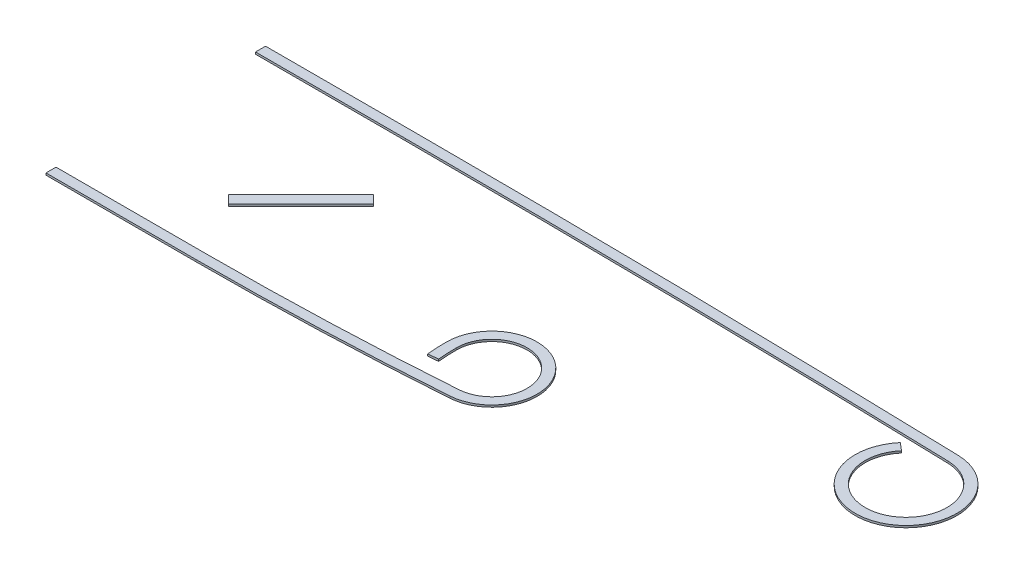
ISO-10303-21;
HEADER;
FILE_DESCRIPTION(('STEP AP214'),'2;1');
FILE_NAME('part.step','',(''),(''),'','','');
FILE_SCHEMA(('AUTOMOTIVE_DESIGN { 1 0 10303 214 1 1 1 1 }'));
ENDSEC;
DATA;
#1=APPLICATION_CONTEXT('core data for automotive mechanical design processes');
#2=APPLICATION_PROTOCOL_DEFINITION('international standard','automotive_design',2000,#1);
#3=PRODUCT_CONTEXT('',#1,'mechanical');
#4=PRODUCT('Part','Part','',(#3));
#5=PRODUCT_RELATED_PRODUCT_CATEGORY('part','',(#4));
#6=PRODUCT_DEFINITION_FORMATION('','',#4);
#7=PRODUCT_DEFINITION_CONTEXT('part definition',#1,'design');
#8=PRODUCT_DEFINITION('design','',#6,#7);
#9=PRODUCT_DEFINITION_SHAPE('','',#8);
#10=(LENGTH_UNIT() NAMED_UNIT(*) SI_UNIT(.MILLI.,.METRE.));
#11=(NAMED_UNIT(*) PLANE_ANGLE_UNIT() SI_UNIT($,.RADIAN.));
#12=(NAMED_UNIT(*) SI_UNIT($,.STERADIAN.) SOLID_ANGLE_UNIT());
#13=UNCERTAINTY_MEASURE_WITH_UNIT(LENGTH_MEASURE(1.E-05),#10,'distance_accuracy_value','');
#14=(GEOMETRIC_REPRESENTATION_CONTEXT(3) GLOBAL_UNCERTAINTY_ASSIGNED_CONTEXT((#13)) GLOBAL_UNIT_ASSIGNED_CONTEXT((#10,
#11,#12)) REPRESENTATION_CONTEXT('',''));
#15=CARTESIAN_POINT('',(0.,0.,0.));
#16=DIRECTION('',(0.,0.,1.));
#17=DIRECTION('',(1.,0.,0.));
#18=AXIS2_PLACEMENT_3D('',#15,#16,#17);
#19=CARTESIAN_POINT('',(-16.0124330599693,0.5,20.1914341367819));
#20=DIRECTION('',(0.707106781186546,0.,-0.707106781186549));
#21=DIRECTION('',(-0.707106781186549,0.,-0.707106781186546));
#22=AXIS2_PLACEMENT_3D('',#19,#20,#21);
#23=PLANE('',#22);
#24=DIRECTION('',(0.707106781186549,0.,0.707106781186546));
#25=VECTOR('',#24,1.);
#26=CARTESIAN_POINT('',(-16.0124330599693,-0.5,20.1914341367819));
#27=LINE('',#26,#25);
#28=CARTESIAN_POINT('',(-20.1914341367818,-0.5,16.0124330599694));
#29=VERTEX_POINT('',#28);
#30=CARTESIAN_POINT('',(-16.0124330599693,-0.5,20.1914341367819));
#31=VERTEX_POINT('',#30);
#32=EDGE_CURVE('E105',#29,#31,#27,.T.);
#33=ORIENTED_EDGE('',*,*,#32,.T.);
#34=DIRECTION('',(0.,-1.,0.));
#35=VECTOR('',#34,1.);
#36=CARTESIAN_POINT('',(-16.0124330599693,0.5,20.1914341367819));
#37=LINE('',#36,#35);
#38=CARTESIAN_POINT('',(-16.0124330599693,0.5,20.1914341367819));
#39=VERTEX_POINT('',#38);
#40=EDGE_CURVE('E12',#39,#31,#37,.T.);
#41=ORIENTED_EDGE('',*,*,#40,.F.);
#42=DIRECTION('',(0.707106781186549,0.,0.707106781186546));
#43=VECTOR('',#42,1.);
#44=CARTESIAN_POINT('',(-16.0124330599693,0.5,20.1914341367819));
#45=LINE('',#44,#43);
#46=CARTESIAN_POINT('',(-20.1914341367818,0.5,16.0124330599694));
#47=VERTEX_POINT('',#46);
#48=EDGE_CURVE('E93',#47,#39,#45,.T.);
#49=ORIENTED_EDGE('',*,*,#48,.F.);
#50=DIRECTION('',(0.,-1.,0.));
#51=VECTOR('',#50,1.);
#52=CARTESIAN_POINT('',(-20.1914341367818,0.5,16.0124330599694));
#53=LINE('',#52,#51);
#54=EDGE_CURVE('E101',#47,#29,#53,.T.);
#55=ORIENTED_EDGE('',*,*,#54,.T.);
#56=EDGE_LOOP('',(#33,#41,#49,#55));
#57=FACE_BOUND('',#56,.T.);
#58=ADVANCED_FACE('F42',(#57),#23,.F.);
#59=CARTESIAN_POINT('',(-16.0124330599693,0.5,20.1914341367819));
#60=DIRECTION('',(-0.707106781186549,0.,-0.707106781186546));
#61=DIRECTION('',(-0.707106781186546,0.,0.707106781186549));
#62=AXIS2_PLACEMENT_3D('',#59,#60,#61);
#63=PLANE('',#62);
#64=DIRECTION('',(0.707106781186546,0.,-0.707106781186549));
#65=VECTOR('',#64,1.);
#66=CARTESIAN_POINT('',(-16.0124330599693,-0.5,20.1914341367819));
#67=LINE('',#66,#65);
#68=CARTESIAN_POINT('',(20.1914341367819,-0.5,-16.0124330599694));
#69=VERTEX_POINT('',#68);
#70=EDGE_CURVE('E97',#31,#69,#67,.T.);
#71=ORIENTED_EDGE('',*,*,#70,.T.);
#72=DIRECTION('',(0.,-1.,0.));
#73=VECTOR('',#72,1.);
#74=CARTESIAN_POINT('',(20.1914341367819,0.5,-16.0124330599694));
#75=LINE('',#74,#73);
#76=CARTESIAN_POINT('',(20.1914341367819,0.5,-16.0124330599694));
#77=VERTEX_POINT('',#76);
#78=EDGE_CURVE('E50',#77,#69,#75,.T.);
#79=ORIENTED_EDGE('',*,*,#78,.F.);
#80=DIRECTION('',(0.707106781186546,0.,-0.707106781186549));
#81=VECTOR('',#80,1.);
#82=CARTESIAN_POINT('',(-16.0124330599693,0.5,20.1914341367819));
#83=LINE('',#82,#81);
#84=EDGE_CURVE('E88',#39,#77,#83,.T.);
#85=ORIENTED_EDGE('',*,*,#84,.F.);
#86=ORIENTED_EDGE('',*,*,#40,.T.);
#87=EDGE_LOOP('',(#71,#79,#85,#86));
#88=FACE_BOUND('',#87,.T.);
#89=ADVANCED_FACE('F96',(#88),#63,.F.);
#90=CARTESIAN_POINT('',(20.1914341367819,0.5,-16.0124330599694));
#91=DIRECTION('',(-0.707106781186546,0.,0.707106781186549));
#92=DIRECTION('',(0.707106781186549,0.,0.707106781186546));
#93=AXIS2_PLACEMENT_3D('',#90,#91,#92);
#94=PLANE('',#93);
#95=DIRECTION('',(-0.707106781186549,0.,-0.707106781186546));
#96=VECTOR('',#95,1.);
#97=CARTESIAN_POINT('',(20.1914341367819,-0.5,-16.0124330599694));
#98=LINE('',#97,#96);
#99=CARTESIAN_POINT('',(16.0124330599693,-0.5,-20.1914341367819));
#100=VERTEX_POINT('',#99);
#101=EDGE_CURVE('E75',#69,#100,#98,.T.);
#102=ORIENTED_EDGE('',*,*,#101,.T.);
#103=DIRECTION('',(0.,-1.,0.));
#104=VECTOR('',#103,1.);
#105=CARTESIAN_POINT('',(16.0124330599693,0.5,-20.1914341367819));
#106=LINE('',#105,#104);
#107=CARTESIAN_POINT('',(16.0124330599693,0.5,-20.1914341367819));
#108=VERTEX_POINT('',#107);
#109=EDGE_CURVE('E98',#108,#100,#106,.T.);
#110=ORIENTED_EDGE('',*,*,#109,.F.);
#111=DIRECTION('',(-0.707106781186549,0.,-0.707106781186546));
#112=VECTOR('',#111,1.);
#113=CARTESIAN_POINT('',(20.1914341367819,0.5,-16.0124330599694));
#114=LINE('',#113,#112);
#115=EDGE_CURVE('E91',#77,#108,#114,.T.);
#116=ORIENTED_EDGE('',*,*,#115,.F.);
#117=ORIENTED_EDGE('',*,*,#78,.T.);
#118=EDGE_LOOP('',(#102,#110,#116,#117));
#119=FACE_BOUND('',#118,.T.);
#120=ADVANCED_FACE('F99',(#119),#94,.F.);
#121=CARTESIAN_POINT('',(-20.1914341367818,0.5,16.0124330599694));
#122=DIRECTION('',(0.707106781186549,0.,0.707106781186546));
#123=DIRECTION('',(0.707106781186546,0.,-0.707106781186549));
#124=AXIS2_PLACEMENT_3D('',#121,#122,#123);
#125=PLANE('',#124);
#126=DIRECTION('',(-0.707106781186546,0.,0.707106781186549));
#127=VECTOR('',#126,1.);
#128=CARTESIAN_POINT('',(-20.1914341367818,-0.5,16.0124330599694));
#129=LINE('',#128,#127);
#130=EDGE_CURVE('E81',#100,#29,#129,.T.);
#131=ORIENTED_EDGE('',*,*,#130,.T.);
#132=ORIENTED_EDGE('',*,*,#54,.F.);
#133=DIRECTION('',(-0.707106781186546,0.,0.707106781186549));
#134=VECTOR('',#133,1.);
#135=CARTESIAN_POINT('',(-20.1914341367818,0.5,16.0124330599694));
#136=LINE('',#135,#134);
#137=EDGE_CURVE('E58',#108,#47,#136,.T.);
#138=ORIENTED_EDGE('',*,*,#137,.F.);
#139=ORIENTED_EDGE('',*,*,#109,.T.);
#140=EDGE_LOOP('',(#131,#132,#138,#139));
#141=FACE_BOUND('',#140,.T.);
#142=ADVANCED_FACE('F112',(#141),#125,.F.);
#143=CARTESIAN_POINT('',(-20.1914341367818,0.5,16.0124330599694));
#144=DIRECTION('',(0.,-1.,0.));
#145=DIRECTION('',(0.,0.,-1.));
#146=AXIS2_PLACEMENT_3D('',#143,#144,#145);
#147=PLANE('',#146);
#148=ORIENTED_EDGE('',*,*,#48,.T.);
#149=ORIENTED_EDGE('',*,*,#84,.T.);
#150=ORIENTED_EDGE('',*,*,#115,.T.);
#151=ORIENTED_EDGE('',*,*,#137,.T.);
#152=EDGE_LOOP('',(#148,#149,#150,#151));
#153=FACE_BOUND('',#152,.T.);
#154=ADVANCED_FACE('F89',(#153),#147,.F.);
#155=CARTESIAN_POINT('',(-20.1914341367818,-0.5,16.0124330599694));
#156=DIRECTION('',(0.,-1.,0.));
#157=DIRECTION('',(0.,0.,-1.));
#158=AXIS2_PLACEMENT_3D('',#155,#156,#157);
#159=PLANE('',#158);
#160=ORIENTED_EDGE('',*,*,#32,.F.);
#161=ORIENTED_EDGE('',*,*,#130,.F.);
#162=ORIENTED_EDGE('',*,*,#101,.F.);
#163=ORIENTED_EDGE('',*,*,#70,.F.);
#164=EDGE_LOOP('',(#160,#161,#162,#163));
#165=FACE_BOUND('',#164,.T.);
#166=ADVANCED_FACE('F115',(#165),#159,.T.);
#167=CLOSED_SHELL('',(#58,#89,#120,#142,#154,#166));
#168=MANIFOLD_SOLID_BREP('B2',#167);
#169=CARTESIAN_POINT('',(120.656282085149,0.5,25.3727863089583));
#170=DIRECTION('',(0.,-1.,0.));
#171=DIRECTION('',(0.,0.,-1.));
#172=AXIS2_PLACEMENT_3D('',#169,#170,#171);
#173=CYLINDRICAL_SURFACE('',#172,17.6024889006956);
#174=CARTESIAN_POINT('',(120.656282085149,-0.5,25.3727863089583));
#175=DIRECTION('',(0.,-1.,0.));
#176=DIRECTION('',(0.,0.,1.));
#177=AXIS2_PLACEMENT_3D('',#174,#175,#176);
#178=CIRCLE('',#177,17.6024889006956);
#179=CARTESIAN_POINT('',(103.053793184455,-0.5,25.3727863090941));
#180=VERTEX_POINT('',#179);
#181=CARTESIAN_POINT('',(121.916527169268,-0.5,42.9301038098782));
#182=VERTEX_POINT('',#181);
#183=EDGE_CURVE('E283',#180,#182,#178,.T.);
#184=ORIENTED_EDGE('',*,*,#183,.T.);
#185=DIRECTION('',(0.,-1.,0.));
#186=VECTOR('',#185,1.);
#187=CARTESIAN_POINT('',(121.916527169268,0.5,42.9301038098782));
#188=LINE('',#187,#186);
#189=CARTESIAN_POINT('',(121.916527169268,0.5,42.9301038098782));
#190=VERTEX_POINT('',#189);
#191=EDGE_CURVE('E40',#190,#182,#188,.T.);
#192=ORIENTED_EDGE('',*,*,#191,.F.);
#193=CARTESIAN_POINT('',(120.656282085149,0.5,25.3727863089583));
#194=DIRECTION('',(0.,-1.,0.));
#195=DIRECTION('',(0.,0.,1.));
#196=AXIS2_PLACEMENT_3D('',#193,#194,#195);
#197=CIRCLE('',#196,17.6024889006956);
#198=CARTESIAN_POINT('',(103.053793184455,0.5,25.3727863090941));
#199=VERTEX_POINT('',#198);
#200=EDGE_CURVE('E301',#199,#190,#197,.T.);
#201=ORIENTED_EDGE('',*,*,#200,.F.);
#202=DIRECTION('',(0.,-1.,0.));
#203=VECTOR('',#202,1.);
#204=CARTESIAN_POINT('',(103.053793184455,0.5,25.3727863090941));
#205=LINE('',#204,#203);
#206=EDGE_CURVE('E279',#199,#180,#205,.T.);
#207=ORIENTED_EDGE('',*,*,#206,.T.);
#208=EDGE_LOOP('',(#184,#192,#201,#207));
#209=FACE_BOUND('',#208,.T.);
#210=ADVANCED_FACE('F175',(#209),#173,.F.);
#211=CARTESIAN_POINT('',(0.,0.5,-1655.57061091612));
#212=DIRECTION('',(0.,-1.,0.));
#213=DIRECTION('',(0.,0.,-1.));
#214=AXIS2_PLACEMENT_3D('',#211,#212,#213);
#215=CYLINDRICAL_SURFACE('',#214,1702.87061091609);
#216=CARTESIAN_POINT('',(0.,-0.5,-1655.57061091612));
#217=DIRECTION('',(0.,-1.,0.));
#218=DIRECTION('',(0.,0.,1.));
#219=AXIS2_PLACEMENT_3D('',#216,#217,#218);
#220=CIRCLE('',#219,1702.87061091609);
#221=CARTESIAN_POINT('',(-3.12812256453078E-13,-0.5,47.299999999999));
#222=VERTEX_POINT('',#221);
#223=EDGE_CURVE('E286',#182,#222,#220,.T.);
#224=ORIENTED_EDGE('',*,*,#223,.T.);
#225=DIRECTION('',(0.,-1.,0.));
#226=VECTOR('',#225,1.);
#227=CARTESIAN_POINT('',(-3.12812256453078E-13,0.5,47.299999999999));
#228=LINE('',#227,#226);
#229=CARTESIAN_POINT('',(-3.12812256453078E-13,0.5,47.299999999999));
#230=VERTEX_POINT('',#229);
#231=EDGE_CURVE('E183',#230,#222,#228,.T.);
#232=ORIENTED_EDGE('',*,*,#231,.F.);
#233=CARTESIAN_POINT('',(0.,0.5,-1655.57061091612));
#234=DIRECTION('',(0.,-1.,0.));
#235=DIRECTION('',(0.,0.,1.));
#236=AXIS2_PLACEMENT_3D('',#233,#234,#235);
#237=CIRCLE('',#236,1702.87061091609);
#238=EDGE_CURVE('E240',#190,#230,#237,.T.);
#239=ORIENTED_EDGE('',*,*,#238,.F.);
#240=ORIENTED_EDGE('',*,*,#191,.T.);
#241=EDGE_LOOP('',(#224,#232,#239,#240));
#242=FACE_BOUND('',#241,.T.);
#243=ADVANCED_FACE('F350',(#242),#215,.F.);
#244=CARTESIAN_POINT('',(-3.12812256453078E-13,0.5,47.299999999999));
#245=DIRECTION('',(0.,0.,1.));
#246=DIRECTION('',(1.,0.,0.));
#247=AXIS2_PLACEMENT_3D('',#244,#245,#246);
#248=PLANE('',#247);
#249=DIRECTION('',(-1.,0.,0.));
#250=VECTOR('',#249,1.);
#251=CARTESIAN_POINT('',(-3.12812256453078E-13,-0.5,47.299999999999));
#252=LINE('',#251,#250);
#253=CARTESIAN_POINT('',(-75.0000000000009,-0.5,47.3));
#254=VERTEX_POINT('',#253);
#255=EDGE_CURVE('E288',#222,#254,#252,.T.);
#256=ORIENTED_EDGE('',*,*,#255,.T.);
#257=DIRECTION('',(0.,-1.,0.));
#258=VECTOR('',#257,1.);
#259=CARTESIAN_POINT('',(-75.0000000000009,0.5,47.3));
#260=LINE('',#259,#258);
#261=CARTESIAN_POINT('',(-75.0000000000009,0.5,47.3));
#262=VERTEX_POINT('',#261);
#263=EDGE_CURVE('E314',#262,#254,#260,.T.);
#264=ORIENTED_EDGE('',*,*,#263,.F.);
#265=DIRECTION('',(-1.,0.,0.));
#266=VECTOR('',#265,1.);
#267=CARTESIAN_POINT('',(-3.12812256453078E-13,0.5,47.299999999999));
#268=LINE('',#267,#266);
#269=EDGE_CURVE('E322',#230,#262,#268,.T.);
#270=ORIENTED_EDGE('',*,*,#269,.F.);
#271=ORIENTED_EDGE('',*,*,#231,.T.);
#272=EDGE_LOOP('',(#256,#264,#270,#271));
#273=FACE_BOUND('',#272,.T.);
#274=ADVANCED_FACE('F320',(#273),#248,.F.);
#275=CARTESIAN_POINT('',(-75.0000000000009,0.5,47.3));
#276=DIRECTION('',(1.,0.,0.));
#277=DIRECTION('',(0.,0.,-1.));
#278=AXIS2_PLACEMENT_3D('',#275,#276,#277);
#279=PLANE('',#278);
#280=DIRECTION('',(0.,0.,1.));
#281=VECTOR('',#280,1.);
#282=CARTESIAN_POINT('',(-75.0000000000009,-0.5,47.3));
#283=LINE('',#282,#281);
#284=CARTESIAN_POINT('',(-75.0000000000009,-0.5,52.3));
#285=VERTEX_POINT('',#284);
#286=EDGE_CURVE('E290',#254,#285,#283,.T.);
#287=ORIENTED_EDGE('',*,*,#286,.T.);
#288=DIRECTION('',(0.,-1.,0.));
#289=VECTOR('',#288,1.);
#290=CARTESIAN_POINT('',(-75.0000000000009,0.5,52.3));
#291=LINE('',#290,#289);
#292=CARTESIAN_POINT('',(-75.0000000000009,0.5,52.3));
#293=VERTEX_POINT('',#292);
#294=EDGE_CURVE('E311',#293,#285,#291,.T.);
#295=ORIENTED_EDGE('',*,*,#294,.F.);
#296=DIRECTION('',(0.,0.,1.));
#297=VECTOR('',#296,1.);
#298=CARTESIAN_POINT('',(-75.0000000000009,0.5,47.3));
#299=LINE('',#298,#297);
#300=EDGE_CURVE('E340',#262,#293,#299,.T.);
#301=ORIENTED_EDGE('',*,*,#300,.F.);
#302=ORIENTED_EDGE('',*,*,#263,.T.);
#303=EDGE_LOOP('',(#287,#295,#301,#302));
#304=FACE_BOUND('',#303,.T.);
#305=ADVANCED_FACE('F331',(#304),#279,.F.);
#306=CARTESIAN_POINT('',(0.,0.5,52.3));
#307=DIRECTION('',(0.,0.,-1.));
#308=DIRECTION('',(-1.,0.,0.));
#309=AXIS2_PLACEMENT_3D('',#306,#307,#308);
#310=PLANE('',#309);
#311=DIRECTION('',(1.,0.,0.));
#312=VECTOR('',#311,1.);
#313=CARTESIAN_POINT('',(0.,-0.5,52.3));
#314=LINE('',#313,#312);
#315=CARTESIAN_POINT('',(0.,-0.5,52.2999999999996));
#316=VERTEX_POINT('',#315);
#317=EDGE_CURVE('E292',#285,#316,#314,.T.);
#318=ORIENTED_EDGE('',*,*,#317,.T.);
#319=DIRECTION('',(0.,-1.,0.));
#320=VECTOR('',#319,1.);
#321=CARTESIAN_POINT('',(0.,0.5,52.2999999999996));
#322=LINE('',#321,#320);
#323=CARTESIAN_POINT('',(0.,0.5,52.2999999999996));
#324=VERTEX_POINT('',#323);
#325=EDGE_CURVE('E308',#324,#316,#322,.T.);
#326=ORIENTED_EDGE('',*,*,#325,.F.);
#327=DIRECTION('',(1.,0.,0.));
#328=VECTOR('',#327,1.);
#329=CARTESIAN_POINT('',(0.,0.5,52.3));
#330=LINE('',#329,#328);
#331=EDGE_CURVE('E337',#293,#324,#330,.T.);
#332=ORIENTED_EDGE('',*,*,#331,.F.);
#333=ORIENTED_EDGE('',*,*,#294,.T.);
#334=EDGE_LOOP('',(#318,#326,#332,#333));
#335=FACE_BOUND('',#334,.T.);
#336=ADVANCED_FACE('F335',(#335),#310,.F.);
#337=CARTESIAN_POINT('',(0.,0.5,-1655.57061091612));
#338=DIRECTION('',(0.,-1.,0.));
#339=DIRECTION('',(0.,0.,-1.));
#340=AXIS2_PLACEMENT_3D('',#337,#338,#339);
#341=CYLINDRICAL_SURFACE('',#340,1707.87061091612);
#342=CARTESIAN_POINT('',(0.,-0.5,-1655.57061091612));
#343=DIRECTION('',(0.,1.,0.));
#344=DIRECTION('',(0.,0.,1.));
#345=AXIS2_PLACEMENT_3D('',#342,#343,#344);
#346=CIRCLE('',#345,1707.87061091612);
#347=CARTESIAN_POINT('',(122.274500718128,-0.5,47.9172728402925));
#348=VERTEX_POINT('',#347);
#349=EDGE_CURVE('E294',#316,#348,#346,.T.);
#350=ORIENTED_EDGE('',*,*,#349,.T.);
#351=DIRECTION('',(0.,-1.,0.));
#352=VECTOR('',#351,1.);
#353=CARTESIAN_POINT('',(122.274500718128,0.5,47.9172728402925));
#354=LINE('',#353,#352);
#355=CARTESIAN_POINT('',(122.274500718128,0.5,47.9172728402925));
#356=VERTEX_POINT('',#355);
#357=EDGE_CURVE('E305',#356,#348,#354,.T.);
#358=ORIENTED_EDGE('',*,*,#357,.F.);
#359=CARTESIAN_POINT('',(0.,0.5,-1655.57061091612));
#360=DIRECTION('',(0.,1.,0.));
#361=DIRECTION('',(0.,0.,1.));
#362=AXIS2_PLACEMENT_3D('',#359,#360,#361);
#363=CIRCLE('',#362,1707.87061091612);
#364=EDGE_CURVE('E339',#324,#356,#363,.T.);
#365=ORIENTED_EDGE('',*,*,#364,.F.);
#366=ORIENTED_EDGE('',*,*,#325,.T.);
#367=EDGE_LOOP('',(#350,#358,#365,#366));
#368=FACE_BOUND('',#367,.T.);
#369=ADVANCED_FACE('F362',(#368),#341,.T.);
#370=CARTESIAN_POINT('',(120.656282085149,0.5,25.3727863089583));
#371=DIRECTION('',(0.,-1.,0.));
#372=DIRECTION('',(0.,0.,-1.));
#373=AXIS2_PLACEMENT_3D('',#370,#371,#372);
#374=CYLINDRICAL_SURFACE('',#373,22.6024889006859);
#375=CARTESIAN_POINT('',(120.656282085149,-0.5,25.3727863089583));
#376=DIRECTION('',(0.,1.,0.));
#377=DIRECTION('',(0.,0.,1.));
#378=AXIS2_PLACEMENT_3D('',#375,#376,#377);
#379=CIRCLE('',#378,22.6024889006859);
#380=CARTESIAN_POINT('',(98.05379318453,-0.5,25.3727863090941));
#381=VERTEX_POINT('',#380);
#382=EDGE_CURVE('E296',#348,#381,#379,.T.);
#383=ORIENTED_EDGE('',*,*,#382,.T.);
#384=DIRECTION('',(0.,-1.,0.));
#385=VECTOR('',#384,1.);
#386=CARTESIAN_POINT('',(98.05379318453,0.5,25.3727863090941));
#387=LINE('',#386,#385);
#388=CARTESIAN_POINT('',(98.05379318453,0.5,25.3727863090941));
#389=VERTEX_POINT('',#388);
#390=EDGE_CURVE('E274',#389,#381,#387,.T.);
#391=ORIENTED_EDGE('',*,*,#390,.F.);
#392=CARTESIAN_POINT('',(120.656282085149,0.5,25.3727863089583));
#393=DIRECTION('',(0.,1.,0.));
#394=DIRECTION('',(0.,0.,1.));
#395=AXIS2_PLACEMENT_3D('',#392,#393,#394);
#396=CIRCLE('',#395,22.6024889006859);
#397=EDGE_CURVE('E265',#356,#389,#396,.T.);
#398=ORIENTED_EDGE('',*,*,#397,.F.);
#399=ORIENTED_EDGE('',*,*,#357,.T.);
#400=EDGE_LOOP('',(#383,#391,#398,#399));
#401=FACE_BOUND('',#400,.T.);
#402=ADVANCED_FACE('F365',(#401),#374,.T.);
#403=CARTESIAN_POINT('',(197.867190734202,0.5,25.3727863090941));
#404=DIRECTION('',(0.,-1.,0.));
#405=DIRECTION('',(0.,0.,-1.));
#406=AXIS2_PLACEMENT_3D('',#403,#404,#405);
#407=CYLINDRICAL_SURFACE('',#406,99.8133975496718);
#408=CARTESIAN_POINT('',(197.867190734202,-0.5,25.3727863090941));
#409=DIRECTION('',(0.,1.,0.));
#410=DIRECTION('',(0.,0.,1.));
#411=AXIS2_PLACEMENT_3D('',#408,#409,#410);
#412=CIRCLE('',#411,99.8133975496718);
#413=CARTESIAN_POINT('',(98.5459184119683,-0.5,35.2722405719081));
#414=VERTEX_POINT('',#413);
#415=EDGE_CURVE('E273',#381,#414,#412,.T.);
#416=ORIENTED_EDGE('',*,*,#415,.T.);
#417=DIRECTION('',(0.,-1.,0.));
#418=VECTOR('',#417,1.);
#419=CARTESIAN_POINT('',(98.5459184119683,0.5,35.2722405719081));
#420=LINE('',#419,#418);
#421=CARTESIAN_POINT('',(98.5459184119683,0.5,35.2722405719081));
#422=VERTEX_POINT('',#421);
#423=EDGE_CURVE('E270',#422,#414,#420,.T.);
#424=ORIENTED_EDGE('',*,*,#423,.F.);
#425=CARTESIAN_POINT('',(197.867190734202,0.5,25.3727863090941));
#426=DIRECTION('',(0.,1.,0.));
#427=DIRECTION('',(0.,0.,1.));
#428=AXIS2_PLACEMENT_3D('',#425,#426,#427);
#429=CIRCLE('',#428,99.8133975496718);
#430=EDGE_CURVE('E259',#389,#422,#429,.T.);
#431=ORIENTED_EDGE('',*,*,#430,.F.);
#432=ORIENTED_EDGE('',*,*,#390,.T.);
#433=EDGE_LOOP('',(#416,#424,#431,#432));
#434=FACE_BOUND('',#433,.T.);
#435=ADVANCED_FACE('F271',(#434),#407,.T.);
#436=CARTESIAN_POINT('',(98.5459184119683,0.5,35.2722405719081));
#437=DIRECTION('',(-0.0991796142185028,0.,-0.995069547380217));
#438=DIRECTION('',(-0.995069547380217,0.,0.0991796142185028));
#439=AXIS2_PLACEMENT_3D('',#436,#437,#438);
#440=PLANE('',#439);
#441=DIRECTION('',(0.995069547380217,0.,-0.0991796142185028));
#442=VECTOR('',#441,1.);
#443=CARTESIAN_POINT('',(98.5459184119683,-0.5,35.2722405719081));
#444=LINE('',#443,#442);
#445=CARTESIAN_POINT('',(103.521266148795,-0.5,34.776342500823));
#446=VERTEX_POINT('',#445);
#447=EDGE_CURVE('E226',#414,#446,#444,.T.);
#448=ORIENTED_EDGE('',*,*,#447,.T.);
#449=DIRECTION('',(0.,-1.,0.));
#450=VECTOR('',#449,1.);
#451=CARTESIAN_POINT('',(103.521266148795,0.5,34.776342500823));
#452=LINE('',#451,#450);
#453=CARTESIAN_POINT('',(103.521266148795,0.5,34.776342500823));
#454=VERTEX_POINT('',#453);
#455=EDGE_CURVE('E275',#454,#446,#452,.T.);
#456=ORIENTED_EDGE('',*,*,#455,.F.);
#457=DIRECTION('',(0.995069547380217,0.,-0.0991796142185028));
#458=VECTOR('',#457,1.);
#459=CARTESIAN_POINT('',(98.5459184119683,0.5,35.2722405719081));
#460=LINE('',#459,#458);
#461=EDGE_CURVE('E263',#422,#454,#460,.T.);
#462=ORIENTED_EDGE('',*,*,#461,.F.);
#463=ORIENTED_EDGE('',*,*,#423,.T.);
#464=EDGE_LOOP('',(#448,#456,#462,#463));
#465=FACE_BOUND('',#464,.T.);
#466=ADVANCED_FACE('F277',(#465),#440,.F.);
#467=CARTESIAN_POINT('',(197.867190734202,0.5,25.3727863090941));
#468=DIRECTION('',(0.,-1.,0.));
#469=DIRECTION('',(0.,0.,-1.));
#470=AXIS2_PLACEMENT_3D('',#467,#468,#469);
#471=CYLINDRICAL_SURFACE('',#470,94.8133975497467);
#472=CARTESIAN_POINT('',(197.867190734202,-0.5,25.3727863090941));
#473=DIRECTION('',(0.,-1.,0.));
#474=DIRECTION('',(0.,0.,1.));
#475=AXIS2_PLACEMENT_3D('',#472,#473,#474);
#476=CIRCLE('',#475,94.8133975497467);
#477=EDGE_CURVE('E232',#446,#180,#476,.T.);
#478=ORIENTED_EDGE('',*,*,#477,.T.);
#479=ORIENTED_EDGE('',*,*,#206,.F.);
#480=CARTESIAN_POINT('',(197.867190734202,0.5,25.3727863090941));
#481=DIRECTION('',(0.,-1.,0.));
#482=DIRECTION('',(0.,0.,1.));
#483=AXIS2_PLACEMENT_3D('',#480,#481,#482);
#484=CIRCLE('',#483,94.8133975497467);
#485=EDGE_CURVE('E191',#454,#199,#484,.T.);
#486=ORIENTED_EDGE('',*,*,#485,.F.);
#487=ORIENTED_EDGE('',*,*,#455,.T.);
#488=EDGE_LOOP('',(#478,#479,#486,#487));
#489=FACE_BOUND('',#488,.T.);
#490=ADVANCED_FACE('F374',(#489),#471,.F.);
#491=CARTESIAN_POINT('',(120.656282085149,0.5,25.3727863089583));
#492=DIRECTION('',(0.,1.,0.));
#493=DIRECTION('',(0.,0.,1.));
#494=AXIS2_PLACEMENT_3D('',#491,#492,#493);
#495=PLANE('',#494);
#496=ORIENTED_EDGE('',*,*,#200,.T.);
#497=ORIENTED_EDGE('',*,*,#238,.T.);
#498=ORIENTED_EDGE('',*,*,#269,.T.);
#499=ORIENTED_EDGE('',*,*,#300,.T.);
#500=ORIENTED_EDGE('',*,*,#331,.T.);
#501=ORIENTED_EDGE('',*,*,#364,.T.);
#502=ORIENTED_EDGE('',*,*,#397,.T.);
#503=ORIENTED_EDGE('',*,*,#430,.T.);
#504=ORIENTED_EDGE('',*,*,#461,.T.);
#505=ORIENTED_EDGE('',*,*,#485,.T.);
#506=EDGE_LOOP('',(#496,#497,#498,#499,#500,#501,#502,#503,#504,#505));
#507=FACE_BOUND('',#506,.T.);
#508=ADVANCED_FACE('F261',(#507),#495,.T.);
#509=CARTESIAN_POINT('',(120.656282085149,-0.5,25.3727863089583));
#510=DIRECTION('',(0.,1.,0.));
#511=DIRECTION('',(0.,0.,1.));
#512=AXIS2_PLACEMENT_3D('',#509,#510,#511);
#513=PLANE('',#512);
#514=ORIENTED_EDGE('',*,*,#183,.F.);
#515=ORIENTED_EDGE('',*,*,#477,.F.);
#516=ORIENTED_EDGE('',*,*,#447,.F.);
#517=ORIENTED_EDGE('',*,*,#415,.F.);
#518=ORIENTED_EDGE('',*,*,#382,.F.);
#519=ORIENTED_EDGE('',*,*,#349,.F.);
#520=ORIENTED_EDGE('',*,*,#317,.F.);
#521=ORIENTED_EDGE('',*,*,#286,.F.);
#522=ORIENTED_EDGE('',*,*,#255,.F.);
#523=ORIENTED_EDGE('',*,*,#223,.F.);
#524=EDGE_LOOP('',(#514,#515,#516,#517,#518,#519,#520,#521,#522,#523));
#525=FACE_BOUND('',#524,.T.);
#526=ADVANCED_FACE('F326',(#525),#513,.F.);
#527=CLOSED_SHELL('',(#210,#243,#274,#305,#336,#369,#402,#435,#466,#490,#508,#526));
#528=MANIFOLD_SOLID_BREP('B6',#527);
#529=CARTESIAN_POINT('',(0.,0.5,9367.71781924814));
#530=DIRECTION('',(0.,-1.,0.));
#531=DIRECTION('',(0.,0.,-1.));
#532=AXIS2_PLACEMENT_3D('',#529,#530,#531);
#533=CYLINDRICAL_SURFACE('',#532,9425.01781924814);
#534=CARTESIAN_POINT('',(0.,-0.5,9367.71781924814));
#535=DIRECTION('',(0.,1.,0.));
#536=DIRECTION('',(0.,0.,-1.));
#537=AXIS2_PLACEMENT_3D('',#534,#535,#536);
#538=CIRCLE('',#537,9425.01781924814);
#539=CARTESIAN_POINT('',(274.932364519378,-0.5,-53.2891910498965));
#540=VERTEX_POINT('',#539);
#541=CARTESIAN_POINT('',(-8.63236226984787E-13,-0.5,-57.2999999999997));
#542=VERTEX_POINT('',#541);
#543=EDGE_CURVE('E551',#540,#542,#538,.T.);
#544=ORIENTED_EDGE('',*,*,#543,.T.);
#545=DIRECTION('',(0.,-1.,0.));
#546=VECTOR('',#545,1.);
#547=CARTESIAN_POINT('',(-8.63236226984787E-13,0.5,-57.2999999999997));
#548=LINE('',#547,#546);
#549=CARTESIAN_POINT('',(-8.63236226984787E-13,0.5,-57.2999999999997));
#550=VERTEX_POINT('',#549);
#551=EDGE_CURVE('E173',#550,#542,#548,.T.);
#552=ORIENTED_EDGE('',*,*,#551,.F.);
#553=CARTESIAN_POINT('',(0.,0.5,9367.71781924814));
#554=DIRECTION('',(0.,1.,0.));
#555=DIRECTION('',(0.,0.,-1.));
#556=AXIS2_PLACEMENT_3D('',#553,#554,#555);
#557=CIRCLE('',#556,9425.01781924814);
#558=CARTESIAN_POINT('',(274.932364519378,0.5,-53.2891910498965));
#559=VERTEX_POINT('',#558);
#560=EDGE_CURVE('E567',#559,#550,#557,.T.);
#561=ORIENTED_EDGE('',*,*,#560,.F.);
#562=DIRECTION('',(0.,-1.,0.));
#563=VECTOR('',#562,1.);
#564=CARTESIAN_POINT('',(274.932364519378,0.5,-53.2891910498965));
#565=LINE('',#564,#563);
#566=EDGE_CURVE('E547',#559,#540,#565,.T.);
#567=ORIENTED_EDGE('',*,*,#566,.T.);
#568=EDGE_LOOP('',(#544,#552,#561,#567));
#569=FACE_BOUND('',#568,.T.);
#570=ADVANCED_FACE('F455',(#569),#533,.T.);
#571=CARTESIAN_POINT('',(-8.63236226984787E-13,0.5,-57.2999999999997));
#572=DIRECTION('',(0.,0.,1.));
#573=DIRECTION('',(1.,0.,0.));
#574=AXIS2_PLACEMENT_3D('',#571,#572,#573);
#575=PLANE('',#574);
#576=DIRECTION('',(-1.,0.,0.));
#577=VECTOR('',#576,1.);
#578=CARTESIAN_POINT('',(-8.63236226984787E-13,-0.5,-57.2999999999997));
#579=LINE('',#578,#577);
#580=CARTESIAN_POINT('',(-75.0000000000009,-0.5,-57.3));
#581=VERTEX_POINT('',#580);
#582=EDGE_CURVE('E554',#542,#581,#579,.T.);
#583=ORIENTED_EDGE('',*,*,#582,.T.);
#584=DIRECTION('',(0.,-1.,0.));
#585=VECTOR('',#584,1.);
#586=CARTESIAN_POINT('',(-75.0000000000009,0.5,-57.3));
#587=LINE('',#586,#585);
#588=CARTESIAN_POINT('',(-75.0000000000009,0.5,-57.3));
#589=VERTEX_POINT('',#588);
#590=EDGE_CURVE('E463',#589,#581,#587,.T.);
#591=ORIENTED_EDGE('',*,*,#590,.F.);
#592=DIRECTION('',(-1.,0.,0.));
#593=VECTOR('',#592,1.);
#594=CARTESIAN_POINT('',(-8.63236226984787E-13,0.5,-57.2999999999997));
#595=LINE('',#594,#593);
#596=EDGE_CURVE('E512',#550,#589,#595,.T.);
#597=ORIENTED_EDGE('',*,*,#596,.F.);
#598=ORIENTED_EDGE('',*,*,#551,.T.);
#599=EDGE_LOOP('',(#583,#591,#597,#598));
#600=FACE_BOUND('',#599,.T.);
#601=ADVANCED_FACE('F600',(#600),#575,.F.);
#602=CARTESIAN_POINT('',(-75.0000000000009,0.5,-57.3));
#603=DIRECTION('',(1.,0.,0.));
#604=DIRECTION('',(0.,0.,-1.));
#605=AXIS2_PLACEMENT_3D('',#602,#603,#604);
#606=PLANE('',#605);
#607=DIRECTION('',(0.,0.,1.));
#608=VECTOR('',#607,1.);
#609=CARTESIAN_POINT('',(-75.0000000000009,-0.5,-57.3));
#610=LINE('',#609,#608);
#611=CARTESIAN_POINT('',(-75.0000000000009,-0.5,-52.3));
#612=VERTEX_POINT('',#611);
#613=EDGE_CURVE('E556',#581,#612,#610,.T.);
#614=ORIENTED_EDGE('',*,*,#613,.T.);
#615=DIRECTION('',(0.,-1.,0.));
#616=VECTOR('',#615,1.);
#617=CARTESIAN_POINT('',(-75.0000000000009,0.5,-52.3));
#618=LINE('',#617,#616);
#619=CARTESIAN_POINT('',(-75.0000000000009,0.5,-52.3));
#620=VERTEX_POINT('',#619);
#621=EDGE_CURVE('E574',#620,#612,#618,.T.);
#622=ORIENTED_EDGE('',*,*,#621,.F.);
#623=DIRECTION('',(0.,0.,1.));
#624=VECTOR('',#623,1.);
#625=CARTESIAN_POINT('',(-75.0000000000009,0.5,-57.3));
#626=LINE('',#625,#624);
#627=EDGE_CURVE('E582',#589,#620,#626,.T.);
#628=ORIENTED_EDGE('',*,*,#627,.F.);
#629=ORIENTED_EDGE('',*,*,#590,.T.);
#630=EDGE_LOOP('',(#614,#622,#628,#629));
#631=FACE_BOUND('',#630,.T.);
#632=ADVANCED_FACE('F580',(#631),#606,.F.);
#633=CARTESIAN_POINT('',(-1.13273887497496E-12,0.5,-52.299999999998));
#634=DIRECTION('',(0.,0.,-1.));
#635=DIRECTION('',(-1.,0.,0.));
#636=AXIS2_PLACEMENT_3D('',#633,#634,#635);
#637=PLANE('',#636);
#638=DIRECTION('',(1.,0.,0.));
#639=VECTOR('',#638,1.);
#640=CARTESIAN_POINT('',(-1.13273887497496E-12,-0.5,-52.299999999998));
#641=LINE('',#640,#639);
#642=CARTESIAN_POINT('',(-1.13273887497496E-12,-0.5,-52.299999999998));
#643=VERTEX_POINT('',#642);
#644=EDGE_CURVE('E558',#612,#643,#641,.T.);
#645=ORIENTED_EDGE('',*,*,#644,.T.);
#646=DIRECTION('',(0.,-1.,0.));
#647=VECTOR('',#646,1.);
#648=CARTESIAN_POINT('',(-1.13273887497496E-12,0.5,-52.299999999998));
#649=LINE('',#648,#647);
#650=CARTESIAN_POINT('',(-1.13273887497496E-12,0.5,-52.299999999998));
#651=VERTEX_POINT('',#650);
#652=EDGE_CURVE('E571',#651,#643,#649,.T.);
#653=ORIENTED_EDGE('',*,*,#652,.F.);
#654=DIRECTION('',(1.,0.,0.));
#655=VECTOR('',#654,1.);
#656=CARTESIAN_POINT('',(-1.13273887497496E-12,0.5,-52.299999999998));
#657=LINE('',#656,#655);
#658=EDGE_CURVE('E592',#620,#651,#657,.T.);
#659=ORIENTED_EDGE('',*,*,#658,.F.);
#660=ORIENTED_EDGE('',*,*,#621,.T.);
#661=EDGE_LOOP('',(#645,#653,#659,#660));
#662=FACE_BOUND('',#661,.T.);
#663=ADVANCED_FACE('F588',(#662),#637,.F.);
#664=CARTESIAN_POINT('',(0.,0.5,9367.71781924814));
#665=DIRECTION('',(0.,-1.,0.));
#666=DIRECTION('',(0.,0.,-1.));
#667=AXIS2_PLACEMENT_3D('',#664,#665,#666);
#668=CYLINDRICAL_SURFACE('',#667,9420.01781924814);
#669=CARTESIAN_POINT('',(0.,-0.5,9367.71781924814));
#670=DIRECTION('',(0.,-1.,0.));
#671=DIRECTION('',(0.,0.,-1.));
#672=AXIS2_PLACEMENT_3D('',#669,#670,#671);
#673=CIRCLE('',#672,9420.01781924814);
#674=CARTESIAN_POINT('',(274.786512081859,-0.5,-48.2913187959788));
#675=VERTEX_POINT('',#674);
#676=EDGE_CURVE('E560',#643,#675,#673,.T.);
#677=ORIENTED_EDGE('',*,*,#676,.T.);
#678=DIRECTION('',(0.,-1.,0.));
#679=VECTOR('',#678,1.);
#680=CARTESIAN_POINT('',(274.786512081859,0.5,-48.2913187959788));
#681=LINE('',#680,#679);
#682=CARTESIAN_POINT('',(274.786512081859,0.5,-48.2913187959788));
#683=VERTEX_POINT('',#682);
#684=EDGE_CURVE('E542',#683,#675,#681,.T.);
#685=ORIENTED_EDGE('',*,*,#684,.F.);
#686=CARTESIAN_POINT('',(0.,0.5,9367.71781924814));
#687=DIRECTION('',(0.,-1.,0.));
#688=DIRECTION('',(0.,0.,-1.));
#689=AXIS2_PLACEMENT_3D('',#686,#687,#688);
#690=CIRCLE('',#689,9420.01781924814);
#691=EDGE_CURVE('E532',#651,#683,#690,.T.);
#692=ORIENTED_EDGE('',*,*,#691,.F.);
#693=ORIENTED_EDGE('',*,*,#652,.T.);
#694=EDGE_LOOP('',(#677,#685,#692,#693));
#695=FACE_BOUND('',#694,.T.);
#696=ADVANCED_FACE('F591',(#695),#668,.F.);
#697=CARTESIAN_POINT('',(274.191434136782,0.5,-27.9));
#698=DIRECTION('',(0.,-1.,0.));
#699=DIRECTION('',(0.,0.,-1.));
#700=AXIS2_PLACEMENT_3D('',#697,#698,#699);
#701=CYLINDRICAL_SURFACE('',#700,20.4);
#702=CARTESIAN_POINT('',(274.191434136782,-0.5,-27.9));
#703=DIRECTION('',(0.,-1.,0.));
#704=DIRECTION('',(0.,0.,-1.));
#705=AXIS2_PLACEMENT_3D('',#702,#703,#704);
#706=CIRCLE('',#705,20.4);
#707=CARTESIAN_POINT('',(258.661339000957,-0.5,-41.1278548930746));
#708=VERTEX_POINT('',#707);
#709=EDGE_CURVE('E540',#675,#708,#706,.T.);
#710=ORIENTED_EDGE('',*,*,#709,.T.);
#711=DIRECTION('',(0.,-1.,0.));
#712=VECTOR('',#711,1.);
#713=CARTESIAN_POINT('',(258.661339000957,0.5,-41.1278548930746));
#714=LINE('',#713,#712);
#715=CARTESIAN_POINT('',(258.661339000957,0.5,-41.1278548930746));
#716=VERTEX_POINT('',#715);
#717=EDGE_CURVE('E538',#716,#708,#714,.T.);
#718=ORIENTED_EDGE('',*,*,#717,.F.);
#719=CARTESIAN_POINT('',(274.191434136782,0.5,-27.9));
#720=DIRECTION('',(0.,-1.,0.));
#721=DIRECTION('',(0.,0.,-1.));
#722=AXIS2_PLACEMENT_3D('',#719,#720,#721);
#723=CIRCLE('',#722,20.4);
#724=EDGE_CURVE('E525',#683,#716,#723,.T.);
#725=ORIENTED_EDGE('',*,*,#724,.F.);
#726=ORIENTED_EDGE('',*,*,#684,.T.);
#727=EDGE_LOOP('',(#710,#718,#725,#726));
#728=FACE_BOUND('',#727,.T.);
#729=ADVANCED_FACE('F539',(#728),#701,.F.);
#730=CARTESIAN_POINT('',(258.661339000957,0.5,-41.1278548930746));
#731=DIRECTION('',(-0.648424259464441,0.,0.761279173324735));
#732=DIRECTION('',(0.761279173324735,0.,0.648424259464441));
#733=AXIS2_PLACEMENT_3D('',#730,#731,#732);
#734=PLANE('',#733);
#735=DIRECTION('',(-0.761279173324735,0.,-0.648424259464441));
#736=VECTOR('',#735,1.);
#737=CARTESIAN_POINT('',(258.661339000957,-0.5,-41.1278548930746));
#738=LINE('',#737,#736);
#739=CARTESIAN_POINT('',(254.854943134334,-0.5,-44.3699761903968));
#740=VERTEX_POINT('',#739);
#741=EDGE_CURVE('E564',#708,#740,#738,.T.);
#742=ORIENTED_EDGE('',*,*,#741,.T.);
#743=DIRECTION('',(0.,-1.,0.));
#744=VECTOR('',#743,1.);
#745=CARTESIAN_POINT('',(254.854943134334,0.5,-44.3699761903968));
#746=LINE('',#745,#744);
#747=CARTESIAN_POINT('',(254.854943134334,0.5,-44.3699761903968));
#748=VERTEX_POINT('',#747);
#749=EDGE_CURVE('E543',#748,#740,#746,.T.);
#750=ORIENTED_EDGE('',*,*,#749,.F.);
#751=DIRECTION('',(-0.761279173324735,0.,-0.648424259464441));
#752=VECTOR('',#751,1.);
#753=CARTESIAN_POINT('',(258.661339000957,0.5,-41.1278548930746));
#754=LINE('',#753,#752);
#755=EDGE_CURVE('E529',#716,#748,#754,.T.);
#756=ORIENTED_EDGE('',*,*,#755,.F.);
#757=ORIENTED_EDGE('',*,*,#717,.T.);
#758=EDGE_LOOP('',(#742,#750,#756,#757));
#759=FACE_BOUND('',#758,.T.);
#760=ADVANCED_FACE('F545',(#759),#734,.F.);
#761=CARTESIAN_POINT('',(274.191434136782,0.5,-27.9));
#762=DIRECTION('',(0.,-1.,0.));
#763=DIRECTION('',(0.,0.,-1.));
#764=AXIS2_PLACEMENT_3D('',#761,#762,#763);
#765=CYLINDRICAL_SURFACE('',#764,25.3999999999999);
#766=CARTESIAN_POINT('',(274.191434136782,-0.5,-27.9));
#767=DIRECTION('',(0.,1.,0.));
#768=DIRECTION('',(0.,0.,-1.));
#769=AXIS2_PLACEMENT_3D('',#766,#767,#768);
#770=CIRCLE('',#769,25.3999999999999);
#771=EDGE_CURVE('E500',#740,#540,#770,.T.);
#772=ORIENTED_EDGE('',*,*,#771,.T.);
#773=ORIENTED_EDGE('',*,*,#566,.F.);
#774=CARTESIAN_POINT('',(274.191434136782,0.5,-27.9));
#775=DIRECTION('',(0.,1.,0.));
#776=DIRECTION('',(0.,0.,-1.));
#777=AXIS2_PLACEMENT_3D('',#774,#775,#776);
#778=CIRCLE('',#777,25.4);
#779=EDGE_CURVE('E471',#748,#559,#778,.T.);
#780=ORIENTED_EDGE('',*,*,#779,.F.);
#781=ORIENTED_EDGE('',*,*,#749,.T.);
#782=EDGE_LOOP('',(#772,#773,#780,#781));
#783=FACE_BOUND('',#782,.T.);
#784=ADVANCED_FACE('F616',(#783),#765,.T.);
#785=CARTESIAN_POINT('',(0.,0.5,9367.71781924814));
#786=DIRECTION('',(0.,-1.,0.));
#787=DIRECTION('',(0.,0.,-1.));
#788=AXIS2_PLACEMENT_3D('',#785,#786,#787);
#789=PLANE('',#788);
#790=ORIENTED_EDGE('',*,*,#560,.T.);
#791=ORIENTED_EDGE('',*,*,#596,.T.);
#792=ORIENTED_EDGE('',*,*,#627,.T.);
#793=ORIENTED_EDGE('',*,*,#658,.T.);
#794=ORIENTED_EDGE('',*,*,#691,.T.);
#795=ORIENTED_EDGE('',*,*,#724,.T.);
#796=ORIENTED_EDGE('',*,*,#755,.T.);
#797=ORIENTED_EDGE('',*,*,#779,.T.);
#798=EDGE_LOOP('',(#790,#791,#792,#793,#794,#795,#796,#797));
#799=FACE_BOUND('',#798,.T.);
#800=ADVANCED_FACE('F527',(#799),#789,.F.);
#801=CARTESIAN_POINT('',(0.,-0.5,9367.71781924814));
#802=DIRECTION('',(0.,-1.,0.));
#803=DIRECTION('',(0.,0.,-1.));
#804=AXIS2_PLACEMENT_3D('',#801,#802,#803);
#805=PLANE('',#804);
#806=ORIENTED_EDGE('',*,*,#543,.F.);
#807=ORIENTED_EDGE('',*,*,#771,.F.);
#808=ORIENTED_EDGE('',*,*,#741,.F.);
#809=ORIENTED_EDGE('',*,*,#709,.F.);
#810=ORIENTED_EDGE('',*,*,#676,.F.);
#811=ORIENTED_EDGE('',*,*,#644,.F.);
#812=ORIENTED_EDGE('',*,*,#613,.F.);
#813=ORIENTED_EDGE('',*,*,#582,.F.);
#814=EDGE_LOOP('',(#806,#807,#808,#809,#810,#811,#812,#813));
#815=FACE_BOUND('',#814,.T.);
#816=ADVANCED_FACE('F584',(#815),#805,.T.);
#817=CLOSED_SHELL('',(#570,#601,#632,#663,#696,#729,#760,#784,#800,#816));
#818=MANIFOLD_SOLID_BREP('B34',#817);
#819=ADVANCED_BREP_SHAPE_REPRESENTATION('',(#18,#168,#528,#818),#14);
#820=SHAPE_DEFINITION_REPRESENTATION(#9,#819);
ENDSEC;
END-ISO-10303-21;
